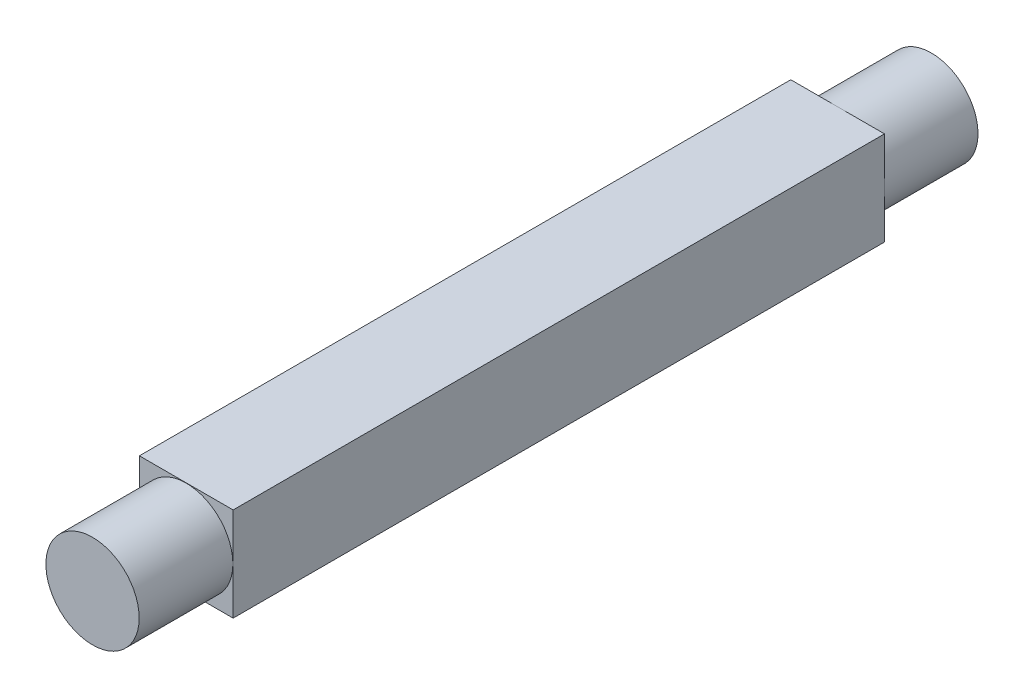
ISO-10303-21;
HEADER;
FILE_DESCRIPTION(('STEP AP214'),'2;1');
FILE_NAME('part.step','',(''),(''),'','','');
FILE_SCHEMA(('AUTOMOTIVE_DESIGN { 1 0 10303 214 1 1 1 1 }'));
ENDSEC;
DATA;
#1=APPLICATION_CONTEXT('core data for automotive mechanical design processes');
#2=APPLICATION_PROTOCOL_DEFINITION('international standard','automotive_design',2000,#1);
#3=PRODUCT_CONTEXT('',#1,'mechanical');
#4=PRODUCT('Part','Part','',(#3));
#5=PRODUCT_RELATED_PRODUCT_CATEGORY('part','',(#4));
#6=PRODUCT_DEFINITION_FORMATION('','',#4);
#7=PRODUCT_DEFINITION_CONTEXT('part definition',#1,'design');
#8=PRODUCT_DEFINITION('design','',#6,#7);
#9=PRODUCT_DEFINITION_SHAPE('','',#8);
#10=(LENGTH_UNIT() NAMED_UNIT(*) SI_UNIT(.MILLI.,.METRE.));
#11=(NAMED_UNIT(*) PLANE_ANGLE_UNIT() SI_UNIT($,.RADIAN.));
#12=(NAMED_UNIT(*) SI_UNIT($,.STERADIAN.) SOLID_ANGLE_UNIT());
#13=UNCERTAINTY_MEASURE_WITH_UNIT(LENGTH_MEASURE(1.E-05),#10,'distance_accuracy_value','');
#14=(GEOMETRIC_REPRESENTATION_CONTEXT(3) GLOBAL_UNCERTAINTY_ASSIGNED_CONTEXT((#13)) GLOBAL_UNIT_ASSIGNED_CONTEXT((#10,
#11,#12)) REPRESENTATION_CONTEXT('',''));
#15=CARTESIAN_POINT('',(0.,0.,0.));
#16=DIRECTION('',(0.,0.,1.));
#17=DIRECTION('',(1.,0.,0.));
#18=AXIS2_PLACEMENT_3D('',#15,#16,#17);
#19=CARTESIAN_POINT('',(-2.,-2.,13.9));
#20=DIRECTION('',(1.,0.,0.));
#21=DIRECTION('',(0.,0.,-1.));
#22=AXIS2_PLACEMENT_3D('',#19,#20,#21);
#23=PLANE('',#22);
#24=DIRECTION('',(0.,-1.,0.));
#25=VECTOR('',#24,1.);
#26=CARTESIAN_POINT('',(-2.,-2.,-13.9));
#27=LINE('',#26,#25);
#28=CARTESIAN_POINT('',(-2.,2.,-13.9));
#29=VERTEX_POINT('',#28);
#30=CARTESIAN_POINT('',(-2.,-2.,-13.9));
#31=VERTEX_POINT('',#30);
#32=EDGE_CURVE('E105',#29,#31,#27,.T.);
#33=ORIENTED_EDGE('',*,*,#32,.T.);
#34=DIRECTION('',(0.,0.,-1.));
#35=VECTOR('',#34,1.);
#36=CARTESIAN_POINT('',(-2.,-2.,13.9));
#37=LINE('',#36,#35);
#38=CARTESIAN_POINT('',(-2.,-2.,13.9));
#39=VERTEX_POINT('',#38);
#40=EDGE_CURVE('E42',#39,#31,#37,.T.);
#41=ORIENTED_EDGE('',*,*,#40,.F.);
#42=DIRECTION('',(0.,-1.,0.));
#43=VECTOR('',#42,1.);
#44=CARTESIAN_POINT('',(-2.,-2.,13.9));
#45=LINE('',#44,#43);
#46=CARTESIAN_POINT('',(-2.,2.,13.9));
#47=VERTEX_POINT('',#46);
#48=EDGE_CURVE('E92',#47,#39,#45,.T.);
#49=ORIENTED_EDGE('',*,*,#48,.F.);
#50=DIRECTION('',(0.,0.,-1.));
#51=VECTOR('',#50,1.);
#52=CARTESIAN_POINT('',(-2.,2.,13.9));
#53=LINE('',#52,#51);
#54=EDGE_CURVE('E101',#47,#29,#53,.T.);
#55=ORIENTED_EDGE('',*,*,#54,.T.);
#56=EDGE_LOOP('',(#33,#41,#49,#55));
#57=FACE_BOUND('',#56,.T.);
#58=ADVANCED_FACE('F39',(#57),#23,.F.);
#59=CARTESIAN_POINT('',(2.,-2.,13.9));
#60=DIRECTION('',(0.,1.,0.));
#61=DIRECTION('',(-1.,0.,0.));
#62=AXIS2_PLACEMENT_3D('',#59,#60,#61);
#63=PLANE('',#62);
#64=DIRECTION('',(1.,0.,0.));
#65=VECTOR('',#64,1.);
#66=CARTESIAN_POINT('',(2.,-2.,-13.9));
#67=LINE('',#66,#65);
#68=CARTESIAN_POINT('',(2.,-2.,-13.9));
#69=VERTEX_POINT('',#68);
#70=EDGE_CURVE('E97',#31,#69,#67,.T.);
#71=ORIENTED_EDGE('',*,*,#70,.T.);
#72=DIRECTION('',(0.,0.,-1.));
#73=VECTOR('',#72,1.);
#74=CARTESIAN_POINT('',(2.,-2.,13.9));
#75=LINE('',#74,#73);
#76=CARTESIAN_POINT('',(2.,-2.,13.9));
#77=VERTEX_POINT('',#76);
#78=EDGE_CURVE('E95',#77,#69,#75,.T.);
#79=ORIENTED_EDGE('',*,*,#78,.F.);
#80=DIRECTION('',(1.,0.,0.));
#81=VECTOR('',#80,1.);
#82=CARTESIAN_POINT('',(2.,-2.,13.9));
#83=LINE('',#82,#81);
#84=EDGE_CURVE('E87',#39,#77,#83,.T.);
#85=ORIENTED_EDGE('',*,*,#84,.F.);
#86=ORIENTED_EDGE('',*,*,#40,.T.);
#87=EDGE_LOOP('',(#71,#79,#85,#86));
#88=FACE_BOUND('',#87,.T.);
#89=ADVANCED_FACE('F96',(#88),#63,.F.);
#90=CARTESIAN_POINT('',(2.,-2.,13.9));
#91=DIRECTION('',(-1.,0.,0.));
#92=DIRECTION('',(0.,0.,1.));
#93=AXIS2_PLACEMENT_3D('',#90,#91,#92);
#94=PLANE('',#93);
#95=DIRECTION('',(0.,1.,0.));
#96=VECTOR('',#95,1.);
#97=CARTESIAN_POINT('',(2.,-2.,-13.9));
#98=LINE('',#97,#96);
#99=CARTESIAN_POINT('',(2.,2.,-13.9));
#100=VERTEX_POINT('',#99);
#101=EDGE_CURVE('E73',#69,#100,#98,.T.);
#102=ORIENTED_EDGE('',*,*,#101,.T.);
#103=DIRECTION('',(0.,0.,-1.));
#104=VECTOR('',#103,1.);
#105=CARTESIAN_POINT('',(2.,2.,13.9));
#106=LINE('',#105,#104);
#107=CARTESIAN_POINT('',(2.,2.,13.9));
#108=VERTEX_POINT('',#107);
#109=EDGE_CURVE('E98',#108,#100,#106,.T.);
#110=ORIENTED_EDGE('',*,*,#109,.F.);
#111=DIRECTION('',(0.,1.,0.));
#112=VECTOR('',#111,1.);
#113=CARTESIAN_POINT('',(2.,-2.,13.9));
#114=LINE('',#113,#112);
#115=EDGE_CURVE('E90',#77,#108,#114,.T.);
#116=ORIENTED_EDGE('',*,*,#115,.F.);
#117=ORIENTED_EDGE('',*,*,#78,.T.);
#118=EDGE_LOOP('',(#102,#110,#116,#117));
#119=FACE_BOUND('',#118,.T.);
#120=ADVANCED_FACE('F99',(#119),#94,.F.);
#121=CARTESIAN_POINT('',(2.,2.,13.9));
#122=DIRECTION('',(0.,-1.,0.));
#123=DIRECTION('',(1.,0.,0.));
#124=AXIS2_PLACEMENT_3D('',#121,#122,#123);
#125=PLANE('',#124);
#126=DIRECTION('',(-1.,0.,0.));
#127=VECTOR('',#126,1.);
#128=CARTESIAN_POINT('',(2.,2.,-13.9));
#129=LINE('',#128,#127);
#130=EDGE_CURVE('E79',#100,#29,#129,.T.);
#131=ORIENTED_EDGE('',*,*,#130,.T.);
#132=ORIENTED_EDGE('',*,*,#54,.F.);
#133=DIRECTION('',(-1.,0.,0.));
#134=VECTOR('',#133,1.);
#135=CARTESIAN_POINT('',(2.,2.,13.9));
#136=LINE('',#135,#134);
#137=EDGE_CURVE('E56',#108,#47,#136,.T.);
#138=ORIENTED_EDGE('',*,*,#137,.F.);
#139=ORIENTED_EDGE('',*,*,#109,.T.);
#140=EDGE_LOOP('',(#131,#132,#138,#139));
#141=FACE_BOUND('',#140,.T.);
#142=ADVANCED_FACE('F113',(#141),#125,.F.);
#143=CARTESIAN_POINT('',(0.,0.,13.9));
#144=DIRECTION('',(0.,0.,1.));
#145=DIRECTION('',(1.,0.,0.));
#146=AXIS2_PLACEMENT_3D('',#143,#144,#145);
#147=PLANE('',#146);
#148=CARTESIAN_POINT('',(0.,0.,13.9));
#149=DIRECTION('',(0.,0.,1.));
#150=DIRECTION('',(1.,0.,0.));
#151=AXIS2_PLACEMENT_3D('',#148,#149,#150);
#152=CIRCLE('',#151,1.99);
#153=CARTESIAN_POINT('',(1.99,0.,13.9));
#154=VERTEX_POINT('',#153);
#155=EDGE_CURVE('E11',#154,#154,#152,.T.);
#156=ORIENTED_EDGE('',*,*,#155,.F.);
#157=EDGE_LOOP('',(#156));
#158=FACE_BOUND('',#157,.T.);
#159=ORIENTED_EDGE('',*,*,#48,.T.);
#160=ORIENTED_EDGE('',*,*,#84,.T.);
#161=ORIENTED_EDGE('',*,*,#115,.T.);
#162=ORIENTED_EDGE('',*,*,#137,.T.);
#163=EDGE_LOOP('',(#159,#160,#161,#162));
#164=FACE_BOUND('',#163,.T.);
#165=ADVANCED_FACE('F88',(#158,#164),#147,.T.);
#166=CARTESIAN_POINT('',(0.,0.,-13.9));
#167=DIRECTION('',(0.,0.,1.));
#168=DIRECTION('',(1.,0.,0.));
#169=AXIS2_PLACEMENT_3D('',#166,#167,#168);
#170=PLANE('',#169);
#171=CARTESIAN_POINT('',(0.,0.,-13.9));
#172=DIRECTION('',(0.,0.,1.));
#173=DIRECTION('',(1.,0.,0.));
#174=AXIS2_PLACEMENT_3D('',#171,#172,#173);
#175=CIRCLE('',#174,1.99);
#176=CARTESIAN_POINT('',(1.99,0.,-13.9));
#177=VERTEX_POINT('',#176);
#178=EDGE_CURVE('E122',#177,#177,#175,.T.);
#179=ORIENTED_EDGE('',*,*,#178,.T.);
#180=EDGE_LOOP('',(#179));
#181=FACE_BOUND('',#180,.T.);
#182=ORIENTED_EDGE('',*,*,#32,.F.);
#183=ORIENTED_EDGE('',*,*,#130,.F.);
#184=ORIENTED_EDGE('',*,*,#101,.F.);
#185=ORIENTED_EDGE('',*,*,#70,.F.);
#186=EDGE_LOOP('',(#182,#183,#184,#185));
#187=FACE_BOUND('',#186,.T.);
#188=ADVANCED_FACE('F116',(#181,#187),#170,.F.);
#189=CARTESIAN_POINT('',(0.,0.,17.9));
#190=DIRECTION('',(0.,0.,-1.));
#191=DIRECTION('',(-1.,0.,0.));
#192=AXIS2_PLACEMENT_3D('',#189,#190,#191);
#193=CYLINDRICAL_SURFACE('',#192,1.99);
#194=CARTESIAN_POINT('',(0.,0.,17.9));
#195=DIRECTION('',(0.,0.,1.));
#196=DIRECTION('',(1.,0.,0.));
#197=AXIS2_PLACEMENT_3D('',#194,#195,#196);
#198=CIRCLE('',#197,1.99);
#199=CARTESIAN_POINT('',(1.99,0.,17.9));
#200=VERTEX_POINT('',#199);
#201=EDGE_CURVE('E108',#200,#200,#198,.T.);
#202=ORIENTED_EDGE('',*,*,#201,.F.);
#203=EDGE_LOOP('',(#202));
#204=FACE_BOUND('',#203,.T.);
#205=ORIENTED_EDGE('',*,*,#155,.T.);
#206=EDGE_LOOP('',(#205));
#207=FACE_BOUND('',#206,.T.);
#208=ADVANCED_FACE('F152',(#204,#207),#193,.T.);
#209=CARTESIAN_POINT('',(0.,0.,17.9));
#210=DIRECTION('',(0.,0.,1.));
#211=DIRECTION('',(1.,0.,0.));
#212=AXIS2_PLACEMENT_3D('',#209,#210,#211);
#213=PLANE('',#212);
#214=ORIENTED_EDGE('',*,*,#201,.T.);
#215=EDGE_LOOP('',(#214));
#216=FACE_BOUND('',#215,.T.);
#217=ADVANCED_FACE('F137',(#216),#213,.T.);
#218=CARTESIAN_POINT('',(0.,0.,-17.9));
#219=DIRECTION('',(0.,0.,1.));
#220=DIRECTION('',(1.,0.,0.));
#221=AXIS2_PLACEMENT_3D('',#218,#219,#220);
#222=CYLINDRICAL_SURFACE('',#221,1.99);
#223=CARTESIAN_POINT('',(0.,0.,-17.9));
#224=DIRECTION('',(0.,0.,1.));
#225=DIRECTION('',(1.,0.,0.));
#226=AXIS2_PLACEMENT_3D('',#223,#224,#225);
#227=CIRCLE('',#226,1.99);
#228=CARTESIAN_POINT('',(1.99,0.,-17.9));
#229=VERTEX_POINT('',#228);
#230=EDGE_CURVE('E121',#229,#229,#227,.T.);
#231=ORIENTED_EDGE('',*,*,#230,.T.);
#232=EDGE_LOOP('',(#231));
#233=FACE_BOUND('',#232,.T.);
#234=ORIENTED_EDGE('',*,*,#178,.F.);
#235=EDGE_LOOP('',(#234));
#236=FACE_BOUND('',#235,.T.);
#237=ADVANCED_FACE('F128',(#233,#236),#222,.T.);
#238=CARTESIAN_POINT('',(0.,0.,-17.9));
#239=DIRECTION('',(0.,0.,-1.));
#240=DIRECTION('',(1.,0.,0.));
#241=AXIS2_PLACEMENT_3D('',#238,#239,#240);
#242=PLANE('',#241);
#243=ORIENTED_EDGE('',*,*,#230,.F.);
#244=EDGE_LOOP('',(#243));
#245=FACE_BOUND('',#244,.T.);
#246=ADVANCED_FACE('F131',(#245),#242,.T.);
#247=CLOSED_SHELL('',(#58,#89,#120,#142,#165,#188,#208,#217,#237,#246));
#248=MANIFOLD_SOLID_BREP('B2',#247);
#249=ADVANCED_BREP_SHAPE_REPRESENTATION('',(#18,#248),#14);
#250=SHAPE_DEFINITION_REPRESENTATION(#9,#249);
ENDSEC;
END-ISO-10303-21;
